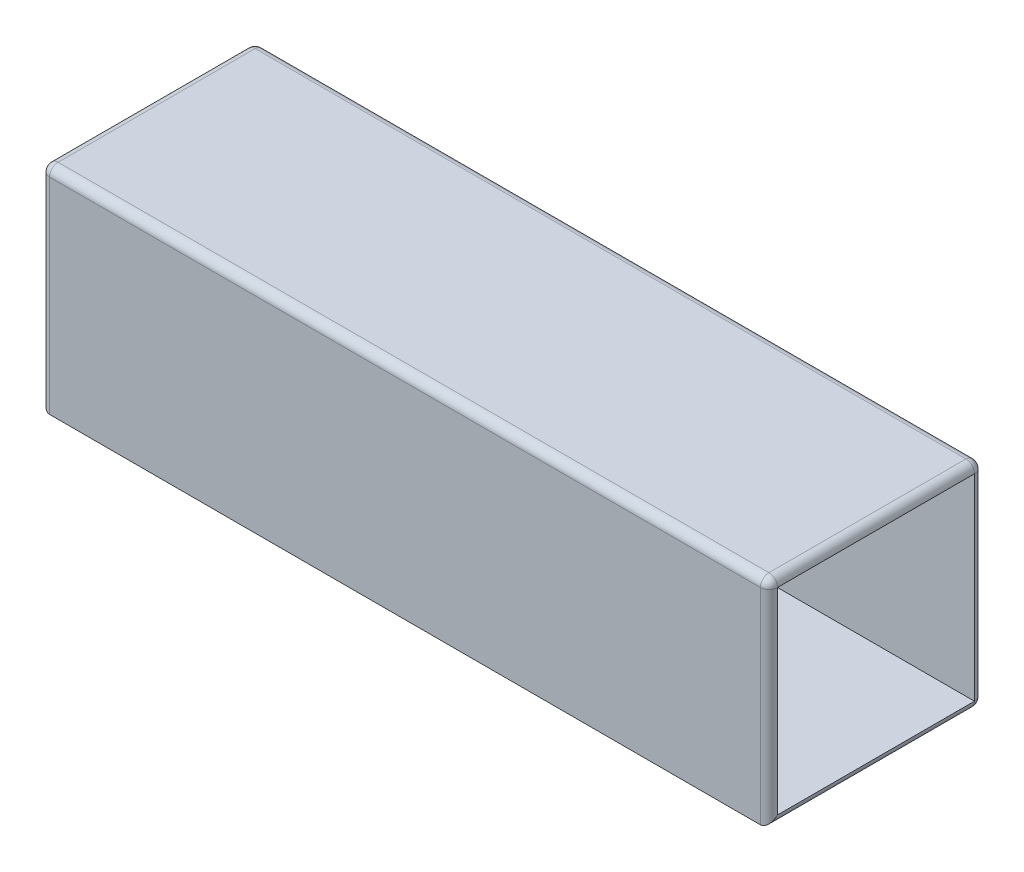
ISO-10303-21;
HEADER;
FILE_DESCRIPTION(('STEP AP214'),'2;1');
FILE_NAME('part.step','',(''),(''),'','','');
FILE_SCHEMA(('AUTOMOTIVE_DESIGN { 1 0 10303 214 1 1 1 1 }'));
ENDSEC;
DATA;
#1=APPLICATION_CONTEXT('core data for automotive mechanical design processes');
#2=APPLICATION_PROTOCOL_DEFINITION('international standard','automotive_design',2000,#1);
#3=PRODUCT_CONTEXT('',#1,'mechanical');
#4=PRODUCT('Part','Part','',(#3));
#5=PRODUCT_RELATED_PRODUCT_CATEGORY('part','',(#4));
#6=PRODUCT_DEFINITION_FORMATION('','',#4);
#7=PRODUCT_DEFINITION_CONTEXT('part definition',#1,'design');
#8=PRODUCT_DEFINITION('design','',#6,#7);
#9=PRODUCT_DEFINITION_SHAPE('','',#8);
#10=(LENGTH_UNIT() NAMED_UNIT(*) SI_UNIT(.MILLI.,.METRE.));
#11=(NAMED_UNIT(*) PLANE_ANGLE_UNIT() SI_UNIT($,.RADIAN.));
#12=(NAMED_UNIT(*) SI_UNIT($,.STERADIAN.) SOLID_ANGLE_UNIT());
#13=UNCERTAINTY_MEASURE_WITH_UNIT(LENGTH_MEASURE(1.E-05),#10,'distance_accuracy_value','');
#14=(GEOMETRIC_REPRESENTATION_CONTEXT(3) GLOBAL_UNCERTAINTY_ASSIGNED_CONTEXT((#13)) GLOBAL_UNIT_ASSIGNED_CONTEXT((#10,
#11,#12)) REPRESENTATION_CONTEXT('',''));
#15=CARTESIAN_POINT('',(0.,0.,0.));
#16=DIRECTION('',(0.,0.,1.));
#17=DIRECTION('',(1.,0.,0.));
#18=AXIS2_PLACEMENT_3D('',#15,#16,#17);
#19=CARTESIAN_POINT('',(-107.95,63.5,31.75));
#20=DIRECTION('',(1.,0.,0.));
#21=DIRECTION('',(0.,0.,-1.));
#22=AXIS2_PLACEMENT_3D('',#19,#20,#21);
#23=PLANE('',#22);
#24=DIRECTION('',(0.,0.,1.));
#25=VECTOR('',#24,1.);
#26=CARTESIAN_POINT('',(-107.95,60.96,-31.75));
#27=LINE('',#26,#25);
#28=CARTESIAN_POINT('',(-107.95,60.96,29.21));
#29=VERTEX_POINT('',#28);
#30=CARTESIAN_POINT('',(-107.95,60.96,-29.21));
#31=VERTEX_POINT('',#30);
#32=EDGE_CURVE('E204',#29,#31,#27,.F.);
#33=ORIENTED_EDGE('',*,*,#32,.T.);
#34=DIRECTION('',(0.,-1.,0.));
#35=VECTOR('',#34,1.);
#36=CARTESIAN_POINT('',(-107.95,63.5,-29.21));
#37=LINE('',#36,#35);
#38=CARTESIAN_POINT('',(-107.95,2.54,-29.21));
#39=VERTEX_POINT('',#38);
#40=EDGE_CURVE('E249',#31,#39,#37,.T.);
#41=ORIENTED_EDGE('',*,*,#40,.T.);
#42=DIRECTION('',(0.,0.,1.));
#43=VECTOR('',#42,1.);
#44=CARTESIAN_POINT('',(-107.95,2.54,31.75));
#45=LINE('',#44,#43);
#46=CARTESIAN_POINT('',(-107.95,2.54,29.21));
#47=VERTEX_POINT('',#46);
#48=EDGE_CURVE('E207',#39,#47,#45,.T.);
#49=ORIENTED_EDGE('',*,*,#48,.T.);
#50=DIRECTION('',(0.,-1.,0.));
#51=VECTOR('',#50,1.);
#52=CARTESIAN_POINT('',(-107.95,63.5,29.21));
#53=LINE('',#52,#51);
#54=EDGE_CURVE('E198',#47,#29,#53,.F.);
#55=ORIENTED_EDGE('',*,*,#54,.T.);
#56=EDGE_LOOP('',(#33,#41,#49,#55));
#57=FACE_BOUND('',#56,.T.);
#58=ADVANCED_FACE('F39',(#57),#23,.F.);
#59=CARTESIAN_POINT('',(107.95,63.5,31.75));
#60=DIRECTION('',(0.,0.,-1.));
#61=DIRECTION('',(-1.,0.,0.));
#62=AXIS2_PLACEMENT_3D('',#59,#60,#61);
#63=PLANE('',#62);
#64=DIRECTION('',(0.,-1.,0.));
#65=VECTOR('',#64,1.);
#66=CARTESIAN_POINT('',(105.41,63.5,31.75));
#67=LINE('',#66,#65);
#68=CARTESIAN_POINT('',(105.41,0.,31.75));
#69=VERTEX_POINT('',#68);
#70=CARTESIAN_POINT('',(105.41,60.96,31.75));
#71=VERTEX_POINT('',#70);
#72=EDGE_CURVE('E196',#69,#71,#67,.F.);
#73=ORIENTED_EDGE('',*,*,#72,.T.);
#74=DIRECTION('',(1.,0.,0.));
#75=VECTOR('',#74,1.);
#76=CARTESIAN_POINT('',(-105.41,60.96,31.75));
#77=LINE('',#76,#75);
#78=CARTESIAN_POINT('',(-105.41,60.96,31.75));
#79=VERTEX_POINT('',#78);
#80=EDGE_CURVE('E11',#71,#79,#77,.F.);
#81=ORIENTED_EDGE('',*,*,#80,.T.);
#82=DIRECTION('',(0.,-1.,0.));
#83=VECTOR('',#82,1.);
#84=CARTESIAN_POINT('',(-105.41,63.5,31.75));
#85=LINE('',#84,#83);
#86=CARTESIAN_POINT('',(-105.41,0.,31.75));
#87=VERTEX_POINT('',#86);
#88=EDGE_CURVE('E223',#79,#87,#85,.T.);
#89=ORIENTED_EDGE('',*,*,#88,.T.);
#90=DIRECTION('',(1.,0.,0.));
#91=VECTOR('',#90,1.);
#92=CARTESIAN_POINT('',(107.95,0.,31.75));
#93=LINE('',#92,#91);
#94=EDGE_CURVE('E167',#87,#69,#93,.T.);
#95=ORIENTED_EDGE('',*,*,#94,.T.);
#96=EDGE_LOOP('',(#73,#81,#89,#95));
#97=FACE_BOUND('',#96,.T.);
#98=ADVANCED_FACE('F369',(#97),#63,.F.);
#99=CARTESIAN_POINT('',(107.95,63.5,-31.75));
#100=DIRECTION('',(0.,0.,1.));
#101=DIRECTION('',(1.,0.,0.));
#102=AXIS2_PLACEMENT_3D('',#99,#100,#101);
#103=PLANE('',#102);
#104=DIRECTION('',(0.,-1.,0.));
#105=VECTOR('',#104,1.);
#106=CARTESIAN_POINT('',(105.41,63.5,-31.75));
#107=LINE('',#106,#105);
#108=CARTESIAN_POINT('',(105.41,60.96,-31.75));
#109=VERTEX_POINT('',#108);
#110=CARTESIAN_POINT('',(105.41,2.54,-31.75));
#111=VERTEX_POINT('',#110);
#112=EDGE_CURVE('E193',#109,#111,#107,.T.);
#113=ORIENTED_EDGE('',*,*,#112,.T.);
#114=DIRECTION('',(-1.,0.,0.));
#115=VECTOR('',#114,1.);
#116=CARTESIAN_POINT('',(107.95,2.54,-31.75));
#117=LINE('',#116,#115);
#118=CARTESIAN_POINT('',(-105.41,2.54,-31.75));
#119=VERTEX_POINT('',#118);
#120=EDGE_CURVE('E243',#111,#119,#117,.T.);
#121=ORIENTED_EDGE('',*,*,#120,.T.);
#122=DIRECTION('',(0.,-1.,0.));
#123=VECTOR('',#122,1.);
#124=CARTESIAN_POINT('',(-105.41,63.5,-31.75));
#125=LINE('',#124,#123);
#126=CARTESIAN_POINT('',(-105.41,60.96,-31.75));
#127=VERTEX_POINT('',#126);
#128=EDGE_CURVE('E241',#119,#127,#125,.F.);
#129=ORIENTED_EDGE('',*,*,#128,.T.);
#130=DIRECTION('',(-1.,0.,0.));
#131=VECTOR('',#130,1.);
#132=CARTESIAN_POINT('',(105.41,60.96,-31.75));
#133=LINE('',#132,#131);
#134=EDGE_CURVE('E239',#127,#109,#133,.F.);
#135=ORIENTED_EDGE('',*,*,#134,.T.);
#136=EDGE_LOOP('',(#113,#121,#129,#135));
#137=FACE_BOUND('',#136,.T.);
#138=ADVANCED_FACE('F318',(#137),#103,.F.);
#139=CARTESIAN_POINT('',(0.,63.5,0.));
#140=DIRECTION('',(0.,1.,0.));
#141=DIRECTION('',(0.,0.,1.));
#142=AXIS2_PLACEMENT_3D('',#139,#140,#141);
#143=PLANE('',#142);
#144=DIRECTION('',(0.,0.,-1.));
#145=VECTOR('',#144,1.);
#146=CARTESIAN_POINT('',(105.41,63.5,-31.75));
#147=LINE('',#146,#145);
#148=CARTESIAN_POINT('',(105.41,63.5,29.21));
#149=VERTEX_POINT('',#148);
#150=CARTESIAN_POINT('',(105.41,63.5,-29.21));
#151=VERTEX_POINT('',#150);
#152=EDGE_CURVE('E190',#149,#151,#147,.T.);
#153=ORIENTED_EDGE('',*,*,#152,.T.);
#154=DIRECTION('',(-1.,0.,0.));
#155=VECTOR('',#154,1.);
#156=CARTESIAN_POINT('',(-105.41,63.5,-29.21));
#157=LINE('',#156,#155);
#158=CARTESIAN_POINT('',(-105.41,63.5,-29.21));
#159=VERTEX_POINT('',#158);
#160=EDGE_CURVE('E48',#151,#159,#157,.T.);
#161=ORIENTED_EDGE('',*,*,#160,.T.);
#162=DIRECTION('',(0.,0.,1.));
#163=VECTOR('',#162,1.);
#164=CARTESIAN_POINT('',(-105.41,63.5,31.75));
#165=LINE('',#164,#163);
#166=CARTESIAN_POINT('',(-105.41,63.5,29.21));
#167=VERTEX_POINT('',#166);
#168=EDGE_CURVE('E220',#159,#167,#165,.T.);
#169=ORIENTED_EDGE('',*,*,#168,.T.);
#170=DIRECTION('',(1.,0.,0.));
#171=VECTOR('',#170,1.);
#172=CARTESIAN_POINT('',(105.41,63.5,29.21));
#173=LINE('',#172,#171);
#174=EDGE_CURVE('E259',#167,#149,#173,.T.);
#175=ORIENTED_EDGE('',*,*,#174,.T.);
#176=EDGE_LOOP('',(#153,#161,#169,#175));
#177=FACE_BOUND('',#176,.T.);
#178=ADVANCED_FACE('F331',(#177),#143,.T.);
#179=CARTESIAN_POINT('',(0.,0.,0.));
#180=DIRECTION('',(0.,1.,0.));
#181=DIRECTION('',(0.,0.,1.));
#182=AXIS2_PLACEMENT_3D('',#179,#180,#181);
#183=PLANE('',#182);
#184=DIRECTION('',(0.,0.,1.));
#185=VECTOR('',#184,1.);
#186=CARTESIAN_POINT('',(-105.41,0.,0.));
#187=LINE('',#186,#185);
#188=CARTESIAN_POINT('',(-105.41,0.,-29.21));
#189=VERTEX_POINT('',#188);
#190=EDGE_CURVE('E209',#87,#189,#187,.F.);
#191=ORIENTED_EDGE('',*,*,#190,.T.);
#192=DIRECTION('',(-1.,0.,0.));
#193=VECTOR('',#192,1.);
#194=CARTESIAN_POINT('',(0.,0.,-29.21));
#195=LINE('',#194,#193);
#196=CARTESIAN_POINT('',(105.41,0.,-29.21));
#197=VERTEX_POINT('',#196);
#198=EDGE_CURVE('E245',#189,#197,#195,.F.);
#199=ORIENTED_EDGE('',*,*,#198,.T.);
#200=DIRECTION('',(0.,0.,-1.));
#201=VECTOR('',#200,1.);
#202=CARTESIAN_POINT('',(105.41,0.,0.));
#203=LINE('',#202,#201);
#204=EDGE_CURVE('E170',#197,#69,#203,.F.);
#205=ORIENTED_EDGE('',*,*,#204,.T.);
#206=ORIENTED_EDGE('',*,*,#94,.F.);
#207=EDGE_LOOP('',(#191,#199,#205,#206));
#208=FACE_BOUND('',#207,.T.);
#209=ADVANCED_FACE('F357',(#208),#183,.F.);
#210=CARTESIAN_POINT('',(-105.41,63.5,31.75));
#211=DIRECTION('',(1.,0.,0.));
#212=DIRECTION('',(0.,0.,-1.));
#213=AXIS2_PLACEMENT_3D('',#210,#211,#212);
#214=PLANE('',#213);
#215=DIRECTION('',(0.,0.,1.));
#216=VECTOR('',#215,1.);
#217=CARTESIAN_POINT('',(-105.41,2.54,31.75));
#218=LINE('',#217,#216);
#219=CARTESIAN_POINT('',(-105.41,2.54,-26.67));
#220=VERTEX_POINT('',#219);
#221=CARTESIAN_POINT('',(-105.41,2.54,29.21));
#222=VERTEX_POINT('',#221);
#223=EDGE_CURVE('E141',#220,#222,#218,.T.);
#224=ORIENTED_EDGE('',*,*,#223,.F.);
#225=DIRECTION('',(0.,-1.,0.));
#226=VECTOR('',#225,1.);
#227=CARTESIAN_POINT('',(-105.41,60.96,-26.67));
#228=LINE('',#227,#226);
#229=CARTESIAN_POINT('',(-105.41,60.96,-26.67));
#230=VERTEX_POINT('',#229);
#231=EDGE_CURVE('E216',#220,#230,#228,.F.);
#232=ORIENTED_EDGE('',*,*,#231,.T.);
#233=DIRECTION('',(0.,0.,1.));
#234=VECTOR('',#233,1.);
#235=CARTESIAN_POINT('',(-105.41,60.96,31.75));
#236=LINE('',#235,#234);
#237=CARTESIAN_POINT('',(-105.41,60.96,29.21));
#238=VERTEX_POINT('',#237);
#239=EDGE_CURVE('E165',#230,#238,#236,.T.);
#240=ORIENTED_EDGE('',*,*,#239,.T.);
#241=DIRECTION('',(0.,-1.,0.));
#242=VECTOR('',#241,1.);
#243=CARTESIAN_POINT('',(-105.41,63.5,29.21));
#244=LINE('',#243,#242);
#245=EDGE_CURVE('E158',#238,#222,#244,.T.);
#246=ORIENTED_EDGE('',*,*,#245,.T.);
#247=EDGE_LOOP('',(#224,#232,#240,#246));
#248=FACE_BOUND('',#247,.T.);
#249=ADVANCED_FACE('F163',(#248),#214,.T.);
#250=CARTESIAN_POINT('',(107.95,63.5,29.21));
#251=DIRECTION('',(0.,0.,-1.));
#252=DIRECTION('',(-1.,0.,0.));
#253=AXIS2_PLACEMENT_3D('',#250,#251,#252);
#254=PLANE('',#253);
#255=DIRECTION('',(1.,0.,0.));
#256=VECTOR('',#255,1.);
#257=CARTESIAN_POINT('',(107.95,2.54,29.21));
#258=LINE('',#257,#256);
#259=CARTESIAN_POINT('',(107.95,2.54,29.21));
#260=VERTEX_POINT('',#259);
#261=EDGE_CURVE('E146',#222,#260,#258,.T.);
#262=ORIENTED_EDGE('',*,*,#261,.F.);
#263=ORIENTED_EDGE('',*,*,#245,.F.);
#264=DIRECTION('',(1.,0.,0.));
#265=VECTOR('',#264,1.);
#266=CARTESIAN_POINT('',(107.95,60.96,29.21));
#267=LINE('',#266,#265);
#268=CARTESIAN_POINT('',(107.95,60.96,29.21));
#269=VERTEX_POINT('',#268);
#270=EDGE_CURVE('E175',#238,#269,#267,.T.);
#271=ORIENTED_EDGE('',*,*,#270,.T.);
#272=DIRECTION('',(0.,-1.,0.));
#273=VECTOR('',#272,1.);
#274=CARTESIAN_POINT('',(107.95,63.5,29.21));
#275=LINE('',#274,#273);
#276=EDGE_CURVE('E159',#269,#260,#275,.T.);
#277=ORIENTED_EDGE('',*,*,#276,.T.);
#278=EDGE_LOOP('',(#262,#263,#271,#277));
#279=FACE_BOUND('',#278,.T.);
#280=ADVANCED_FACE('F156',(#279),#254,.T.);
#281=CARTESIAN_POINT('',(107.95,63.5,-29.21));
#282=DIRECTION('',(0.,0.,1.));
#283=DIRECTION('',(1.,0.,0.));
#284=AXIS2_PLACEMENT_3D('',#281,#282,#283);
#285=PLANE('',#284);
#286=DIRECTION('',(-1.,0.,0.));
#287=VECTOR('',#286,1.);
#288=CARTESIAN_POINT('',(107.95,60.96,-29.21));
#289=LINE('',#288,#287);
#290=CARTESIAN_POINT('',(107.95,60.96,-29.21));
#291=VERTEX_POINT('',#290);
#292=CARTESIAN_POINT('',(-102.87,60.96,-29.21));
#293=VERTEX_POINT('',#292);
#294=EDGE_CURVE('E180',#291,#293,#289,.T.);
#295=ORIENTED_EDGE('',*,*,#294,.T.);
#296=DIRECTION('',(0.,-1.,0.));
#297=VECTOR('',#296,1.);
#298=CARTESIAN_POINT('',(-102.87,2.54,-29.21));
#299=LINE('',#298,#297);
#300=CARTESIAN_POINT('',(-102.87,2.54,-29.21));
#301=VERTEX_POINT('',#300);
#302=EDGE_CURVE('E212',#293,#301,#299,.T.);
#303=ORIENTED_EDGE('',*,*,#302,.T.);
#304=DIRECTION('',(-1.,0.,0.));
#305=VECTOR('',#304,1.);
#306=CARTESIAN_POINT('',(107.95,2.54,-29.21));
#307=LINE('',#306,#305);
#308=CARTESIAN_POINT('',(107.95,2.54,-29.21));
#309=VERTEX_POINT('',#308);
#310=EDGE_CURVE('E176',#309,#301,#307,.T.);
#311=ORIENTED_EDGE('',*,*,#310,.F.);
#312=DIRECTION('',(0.,-1.,0.));
#313=VECTOR('',#312,1.);
#314=CARTESIAN_POINT('',(107.95,63.5,-29.21));
#315=LINE('',#314,#313);
#316=EDGE_CURVE('E172',#291,#309,#315,.T.);
#317=ORIENTED_EDGE('',*,*,#316,.F.);
#318=EDGE_LOOP('',(#295,#303,#311,#317));
#319=FACE_BOUND('',#318,.T.);
#320=ADVANCED_FACE('F307',(#319),#285,.T.);
#321=CARTESIAN_POINT('',(0.,60.96,0.));
#322=DIRECTION('',(0.,1.,0.));
#323=DIRECTION('',(0.,0.,1.));
#324=AXIS2_PLACEMENT_3D('',#321,#322,#323);
#325=PLANE('',#324);
#326=ORIENTED_EDGE('',*,*,#239,.F.);
#327=CARTESIAN_POINT('',(-102.87,60.96,-26.67));
#328=DIRECTION('',(0.,1.,0.));
#329=DIRECTION('',(0.,0.,1.));
#330=AXIS2_PLACEMENT_3D('',#327,#328,#329);
#331=CIRCLE('',#330,2.54);
#332=EDGE_CURVE('E218',#230,#293,#331,.F.);
#333=ORIENTED_EDGE('',*,*,#332,.T.);
#334=ORIENTED_EDGE('',*,*,#294,.F.);
#335=DIRECTION('',(0.,0.,-1.));
#336=VECTOR('',#335,1.);
#337=CARTESIAN_POINT('',(107.95,60.96,31.75));
#338=LINE('',#337,#336);
#339=EDGE_CURVE('E179',#269,#291,#338,.T.);
#340=ORIENTED_EDGE('',*,*,#339,.F.);
#341=ORIENTED_EDGE('',*,*,#270,.F.);
#342=EDGE_LOOP('',(#326,#333,#334,#340,#341));
#343=FACE_BOUND('',#342,.T.);
#344=ADVANCED_FACE('F296',(#343),#325,.F.);
#345=CARTESIAN_POINT('',(0.,2.54,0.));
#346=DIRECTION('',(0.,1.,0.));
#347=DIRECTION('',(0.,0.,1.));
#348=AXIS2_PLACEMENT_3D('',#345,#346,#347);
#349=PLANE('',#348);
#350=ORIENTED_EDGE('',*,*,#310,.T.);
#351=CARTESIAN_POINT('',(-102.87,2.54,-26.67));
#352=DIRECTION('',(0.,1.,0.));
#353=DIRECTION('',(0.,0.,1.));
#354=AXIS2_PLACEMENT_3D('',#351,#352,#353);
#355=CIRCLE('',#354,2.54);
#356=EDGE_CURVE('E148',#301,#220,#355,.T.);
#357=ORIENTED_EDGE('',*,*,#356,.T.);
#358=ORIENTED_EDGE('',*,*,#223,.T.);
#359=ORIENTED_EDGE('',*,*,#261,.T.);
#360=DIRECTION('',(0.,0.,-1.));
#361=VECTOR('',#360,1.);
#362=CARTESIAN_POINT('',(107.95,2.54,31.75));
#363=LINE('',#362,#361);
#364=EDGE_CURVE('E161',#260,#309,#363,.T.);
#365=ORIENTED_EDGE('',*,*,#364,.T.);
#366=EDGE_LOOP('',(#350,#357,#358,#359,#365));
#367=FACE_BOUND('',#366,.T.);
#368=ADVANCED_FACE('F144',(#367),#349,.T.);
#369=CARTESIAN_POINT('',(105.41,60.96,0.));
#370=DIRECTION('',(0.,0.,1.));
#371=DIRECTION('',(1.,0.,0.));
#372=AXIS2_PLACEMENT_3D('',#369,#370,#371);
#373=CYLINDRICAL_SURFACE('',#372,2.54);
#374=ORIENTED_EDGE('',*,*,#339,.T.);
#375=CARTESIAN_POINT('',(105.41,60.96,-29.21));
#376=DIRECTION('',(0.,0.,1.));
#377=DIRECTION('',(1.,0.,0.));
#378=AXIS2_PLACEMENT_3D('',#375,#376,#377);
#379=CIRCLE('',#378,2.54);
#380=EDGE_CURVE('E235',#291,#151,#379,.T.);
#381=ORIENTED_EDGE('',*,*,#380,.T.);
#382=ORIENTED_EDGE('',*,*,#152,.F.);
#383=CARTESIAN_POINT('',(105.41,60.96,29.21));
#384=DIRECTION('',(0.,0.,1.));
#385=DIRECTION('',(1.,0.,0.));
#386=AXIS2_PLACEMENT_3D('',#383,#384,#385);
#387=CIRCLE('',#386,2.54);
#388=EDGE_CURVE('E233',#149,#269,#387,.F.);
#389=ORIENTED_EDGE('',*,*,#388,.T.);
#390=EDGE_LOOP('',(#374,#381,#382,#389));
#391=FACE_BOUND('',#390,.T.);
#392=ADVANCED_FACE('F293',(#391),#373,.T.);
#393=CARTESIAN_POINT('',(105.41,63.5,29.21));
#394=DIRECTION('',(0.,-1.,0.));
#395=DIRECTION('',(0.,0.,-1.));
#396=AXIS2_PLACEMENT_3D('',#393,#394,#395);
#397=CYLINDRICAL_SURFACE('',#396,2.54);
#398=ORIENTED_EDGE('',*,*,#276,.F.);
#399=CARTESIAN_POINT('',(105.41,60.96,29.21));
#400=DIRECTION('',(0.,-1.,0.));
#401=DIRECTION('',(0.,0.,-1.));
#402=AXIS2_PLACEMENT_3D('',#399,#400,#401);
#403=CIRCLE('',#402,2.54);
#404=EDGE_CURVE('E56',#269,#71,#403,.T.);
#405=ORIENTED_EDGE('',*,*,#404,.T.);
#406=ORIENTED_EDGE('',*,*,#72,.F.);
#407=CARTESIAN_POINT('',(105.41,2.54,29.21));
#408=DIRECTION('',(0.,-0.707106781186547,-0.707106781186547));
#409=DIRECTION('',(0.,-0.707106781186547,0.707106781186547));
#410=AXIS2_PLACEMENT_3D('',#407,#408,#409);
#411=ELLIPSE('',#410,3.59210244842766,2.54);
#412=EDGE_CURVE('E152',#260,#69,#411,.T.);
#413=ORIENTED_EDGE('',*,*,#412,.F.);
#414=EDGE_LOOP('',(#398,#405,#406,#413));
#415=FACE_BOUND('',#414,.T.);
#416=ADVANCED_FACE('F297',(#415),#397,.T.);
#417=CARTESIAN_POINT('',(105.41,63.5,-29.21));
#418=DIRECTION('',(0.,-1.,0.));
#419=DIRECTION('',(0.,0.,-1.));
#420=AXIS2_PLACEMENT_3D('',#417,#418,#419);
#421=CYLINDRICAL_SURFACE('',#420,2.54);
#422=ORIENTED_EDGE('',*,*,#112,.F.);
#423=CARTESIAN_POINT('',(105.41,60.96,-29.21));
#424=DIRECTION('',(0.,-1.,0.));
#425=DIRECTION('',(0.,0.,-1.));
#426=AXIS2_PLACEMENT_3D('',#423,#424,#425);
#427=CIRCLE('',#426,2.54);
#428=EDGE_CURVE('E230',#109,#291,#427,.T.);
#429=ORIENTED_EDGE('',*,*,#428,.T.);
#430=ORIENTED_EDGE('',*,*,#316,.T.);
#431=CARTESIAN_POINT('',(105.41,2.54,-29.21));
#432=DIRECTION('',(0.,-1.,0.));
#433=DIRECTION('',(0.,0.,-1.));
#434=AXIS2_PLACEMENT_3D('',#431,#432,#433);
#435=CIRCLE('',#434,2.54);
#436=EDGE_CURVE('E225',#309,#111,#435,.F.);
#437=ORIENTED_EDGE('',*,*,#436,.T.);
#438=EDGE_LOOP('',(#422,#429,#430,#437));
#439=FACE_BOUND('',#438,.T.);
#440=ADVANCED_FACE('F315',(#439),#421,.T.);
#441=CARTESIAN_POINT('',(105.41,2.54,31.75));
#442=DIRECTION('',(0.,0.,-1.));
#443=DIRECTION('',(-1.,0.,0.));
#444=AXIS2_PLACEMENT_3D('',#441,#442,#443);
#445=CYLINDRICAL_SURFACE('',#444,2.54);
#446=ORIENTED_EDGE('',*,*,#204,.F.);
#447=CARTESIAN_POINT('',(105.41,2.54,-29.21));
#448=DIRECTION('',(0.,0.,-1.));
#449=DIRECTION('',(-1.,0.,0.));
#450=AXIS2_PLACEMENT_3D('',#447,#448,#449);
#451=CIRCLE('',#450,2.54);
#452=EDGE_CURVE('E237',#197,#309,#451,.F.);
#453=ORIENTED_EDGE('',*,*,#452,.T.);
#454=ORIENTED_EDGE('',*,*,#364,.F.);
#455=ORIENTED_EDGE('',*,*,#412,.T.);
#456=EDGE_LOOP('',(#446,#453,#454,#455));
#457=FACE_BOUND('',#456,.T.);
#458=ADVANCED_FACE('F301',(#457),#445,.T.);
#459=CARTESIAN_POINT('',(-105.41,60.96,0.));
#460=DIRECTION('',(0.,0.,-1.));
#461=DIRECTION('',(-1.,0.,0.));
#462=AXIS2_PLACEMENT_3D('',#459,#460,#461);
#463=CYLINDRICAL_SURFACE('',#462,2.54);
#464=ORIENTED_EDGE('',*,*,#168,.F.);
#465=CARTESIAN_POINT('',(-105.41,60.96,-29.21));
#466=DIRECTION('',(0.,0.,-1.));
#467=DIRECTION('',(-1.,0.,0.));
#468=AXIS2_PLACEMENT_3D('',#465,#466,#467);
#469=CIRCLE('',#468,2.54);
#470=EDGE_CURVE('E253',#159,#31,#469,.F.);
#471=ORIENTED_EDGE('',*,*,#470,.T.);
#472=ORIENTED_EDGE('',*,*,#32,.F.);
#473=CARTESIAN_POINT('',(-105.41,60.96,29.21));
#474=DIRECTION('',(0.,0.,-1.));
#475=DIRECTION('',(-1.,0.,0.));
#476=AXIS2_PLACEMENT_3D('',#473,#474,#475);
#477=CIRCLE('',#476,2.54);
#478=EDGE_CURVE('E251',#29,#167,#477,.T.);
#479=ORIENTED_EDGE('',*,*,#478,.T.);
#480=EDGE_LOOP('',(#464,#471,#472,#479));
#481=FACE_BOUND('',#480,.T.);
#482=ADVANCED_FACE('F335',(#481),#463,.T.);
#483=CARTESIAN_POINT('',(-105.41,63.5,29.21));
#484=DIRECTION('',(0.,-1.,0.));
#485=DIRECTION('',(0.,0.,-1.));
#486=AXIS2_PLACEMENT_3D('',#483,#484,#485);
#487=CYLINDRICAL_SURFACE('',#486,2.54);
#488=ORIENTED_EDGE('',*,*,#88,.F.);
#489=CARTESIAN_POINT('',(-105.41,60.96,29.21));
#490=DIRECTION('',(0.,-1.,0.));
#491=DIRECTION('',(0.,0.,-1.));
#492=AXIS2_PLACEMENT_3D('',#489,#490,#491);
#493=CIRCLE('',#492,2.54);
#494=EDGE_CURVE('E255',#79,#29,#493,.T.);
#495=ORIENTED_EDGE('',*,*,#494,.T.);
#496=ORIENTED_EDGE('',*,*,#54,.F.);
#497=CARTESIAN_POINT('',(-105.41,2.54,29.21));
#498=DIRECTION('',(0.,-0.707106781186547,-0.707106781186547));
#499=DIRECTION('',(0.,-0.707106781186547,0.707106781186547));
#500=AXIS2_PLACEMENT_3D('',#497,#498,#499);
#501=ELLIPSE('',#500,3.59210244842766,2.54);
#502=EDGE_CURVE('E201',#87,#47,#501,.T.);
#503=ORIENTED_EDGE('',*,*,#502,.F.);
#504=EDGE_LOOP('',(#488,#495,#496,#503));
#505=FACE_BOUND('',#504,.T.);
#506=ADVANCED_FACE('F360',(#505),#487,.T.);
#507=CARTESIAN_POINT('',(-105.41,2.54,31.75));
#508=DIRECTION('',(0.,0.,1.));
#509=DIRECTION('',(1.,0.,0.));
#510=AXIS2_PLACEMENT_3D('',#507,#508,#509);
#511=CYLINDRICAL_SURFACE('',#510,2.54);
#512=ORIENTED_EDGE('',*,*,#48,.F.);
#513=CARTESIAN_POINT('',(-105.41,2.54,-29.21));
#514=DIRECTION('',(0.,0.,1.));
#515=DIRECTION('',(1.,0.,0.));
#516=AXIS2_PLACEMENT_3D('',#513,#514,#515);
#517=CIRCLE('',#516,2.54);
#518=EDGE_CURVE('E247',#39,#189,#517,.T.);
#519=ORIENTED_EDGE('',*,*,#518,.T.);
#520=ORIENTED_EDGE('',*,*,#190,.F.);
#521=ORIENTED_EDGE('',*,*,#502,.T.);
#522=EDGE_LOOP('',(#512,#519,#520,#521));
#523=FACE_BOUND('',#522,.T.);
#524=ADVANCED_FACE('F347',(#523),#511,.T.);
#525=CARTESIAN_POINT('',(-102.87,63.5,-26.67));
#526=DIRECTION('',(0.,1.,0.));
#527=DIRECTION('',(0.,0.,1.));
#528=AXIS2_PLACEMENT_3D('',#525,#526,#527);
#529=CYLINDRICAL_SURFACE('',#528,2.54);
#530=ORIENTED_EDGE('',*,*,#332,.F.);
#531=ORIENTED_EDGE('',*,*,#231,.F.);
#532=ORIENTED_EDGE('',*,*,#356,.F.);
#533=ORIENTED_EDGE('',*,*,#302,.F.);
#534=EDGE_LOOP('',(#530,#531,#532,#533));
#535=FACE_BOUND('',#534,.T.);
#536=ADVANCED_FACE('F387',(#535),#529,.F.);
#537=CARTESIAN_POINT('',(105.41,2.54,-29.21));
#538=DIRECTION('',(0.,0.,1.));
#539=DIRECTION('',(1.,0.,0.));
#540=AXIS2_PLACEMENT_3D('',#537,#538,#539);
#541=SPHERICAL_SURFACE('',#540,2.54);
#542=ORIENTED_EDGE('',*,*,#436,.F.);
#543=ORIENTED_EDGE('',*,*,#452,.F.);
#544=CARTESIAN_POINT('',(105.41,2.54,-29.21));
#545=DIRECTION('',(-1.,0.,0.));
#546=DIRECTION('',(0.,0.,1.));
#547=AXIS2_PLACEMENT_3D('',#544,#545,#546);
#548=CIRCLE('',#547,2.54);
#549=EDGE_CURVE('E228',#111,#197,#548,.T.);
#550=ORIENTED_EDGE('',*,*,#549,.F.);
#551=EDGE_LOOP('',(#542,#543,#550));
#552=FACE_BOUND('',#551,.T.);
#553=ADVANCED_FACE('F311',(#552),#541,.T.);
#554=CARTESIAN_POINT('',(107.95,2.54,-29.21));
#555=DIRECTION('',(-1.,0.,0.));
#556=DIRECTION('',(0.,0.,1.));
#557=AXIS2_PLACEMENT_3D('',#554,#555,#556);
#558=CYLINDRICAL_SURFACE('',#557,2.54);
#559=ORIENTED_EDGE('',*,*,#549,.T.);
#560=ORIENTED_EDGE('',*,*,#198,.F.);
#561=CARTESIAN_POINT('',(-105.41,2.54,-29.21));
#562=DIRECTION('',(-1.,0.,0.));
#563=DIRECTION('',(0.,0.,1.));
#564=AXIS2_PLACEMENT_3D('',#561,#562,#563);
#565=CIRCLE('',#564,2.54);
#566=EDGE_CURVE('E274',#119,#189,#565,.T.);
#567=ORIENTED_EDGE('',*,*,#566,.F.);
#568=ORIENTED_EDGE('',*,*,#120,.F.);
#569=EDGE_LOOP('',(#559,#560,#567,#568));
#570=FACE_BOUND('',#569,.T.);
#571=ADVANCED_FACE('F355',(#570),#558,.T.);
#572=CARTESIAN_POINT('',(-105.41,2.54,-29.21));
#573=DIRECTION('',(0.,0.,1.));
#574=DIRECTION('',(1.,0.,0.));
#575=AXIS2_PLACEMENT_3D('',#572,#573,#574);
#576=SPHERICAL_SURFACE('',#575,2.54);
#577=ORIENTED_EDGE('',*,*,#566,.T.);
#578=ORIENTED_EDGE('',*,*,#518,.F.);
#579=CARTESIAN_POINT('',(-105.41,2.54,-29.21));
#580=DIRECTION('',(0.,1.,0.));
#581=DIRECTION('',(0.,0.,1.));
#582=AXIS2_PLACEMENT_3D('',#579,#580,#581);
#583=CIRCLE('',#582,2.54);
#584=EDGE_CURVE('E271',#119,#39,#583,.T.);
#585=ORIENTED_EDGE('',*,*,#584,.F.);
#586=EDGE_LOOP('',(#577,#578,#585));
#587=FACE_BOUND('',#586,.T.);
#588=ADVANCED_FACE('F352',(#587),#576,.T.);
#589=CARTESIAN_POINT('',(-105.41,63.5,-29.21));
#590=DIRECTION('',(0.,-1.,0.));
#591=DIRECTION('',(0.,0.,-1.));
#592=AXIS2_PLACEMENT_3D('',#589,#590,#591);
#593=CYLINDRICAL_SURFACE('',#592,2.54);
#594=ORIENTED_EDGE('',*,*,#584,.T.);
#595=ORIENTED_EDGE('',*,*,#40,.F.);
#596=CARTESIAN_POINT('',(-105.41,60.96,-29.21));
#597=DIRECTION('',(0.,1.,0.));
#598=DIRECTION('',(0.,0.,1.));
#599=AXIS2_PLACEMENT_3D('',#596,#597,#598);
#600=CIRCLE('',#599,2.54);
#601=EDGE_CURVE('E268',#127,#31,#600,.T.);
#602=ORIENTED_EDGE('',*,*,#601,.F.);
#603=ORIENTED_EDGE('',*,*,#128,.F.);
#604=EDGE_LOOP('',(#594,#595,#602,#603));
#605=FACE_BOUND('',#604,.T.);
#606=ADVANCED_FACE('F341',(#605),#593,.T.);
#607=CARTESIAN_POINT('',(-105.41,60.96,-29.21));
#608=DIRECTION('',(0.,0.,1.));
#609=DIRECTION('',(1.,0.,0.));
#610=AXIS2_PLACEMENT_3D('',#607,#608,#609);
#611=SPHERICAL_SURFACE('',#610,2.54);
#612=ORIENTED_EDGE('',*,*,#601,.T.);
#613=ORIENTED_EDGE('',*,*,#470,.F.);
#614=CARTESIAN_POINT('',(-105.41,60.96,-29.21));
#615=DIRECTION('',(1.,0.,0.));
#616=DIRECTION('',(0.,0.,-1.));
#617=AXIS2_PLACEMENT_3D('',#614,#615,#616);
#618=CIRCLE('',#617,2.54);
#619=EDGE_CURVE('E265',#127,#159,#618,.T.);
#620=ORIENTED_EDGE('',*,*,#619,.F.);
#621=EDGE_LOOP('',(#612,#613,#620));
#622=FACE_BOUND('',#621,.T.);
#623=ADVANCED_FACE('F338',(#622),#611,.T.);
#624=CARTESIAN_POINT('',(0.,60.96,-29.21));
#625=DIRECTION('',(1.,0.,0.));
#626=DIRECTION('',(0.,0.,-1.));
#627=AXIS2_PLACEMENT_3D('',#624,#625,#626);
#628=CYLINDRICAL_SURFACE('',#627,2.54);
#629=ORIENTED_EDGE('',*,*,#619,.T.);
#630=ORIENTED_EDGE('',*,*,#160,.F.);
#631=CARTESIAN_POINT('',(105.41,60.96,-29.21));
#632=DIRECTION('',(1.,0.,0.));
#633=DIRECTION('',(0.,0.,-1.));
#634=AXIS2_PLACEMENT_3D('',#631,#632,#633);
#635=CIRCLE('',#634,2.54);
#636=EDGE_CURVE('E262',#109,#151,#635,.T.);
#637=ORIENTED_EDGE('',*,*,#636,.F.);
#638=ORIENTED_EDGE('',*,*,#134,.F.);
#639=EDGE_LOOP('',(#629,#630,#637,#638));
#640=FACE_BOUND('',#639,.T.);
#641=ADVANCED_FACE('F324',(#640),#628,.T.);
#642=CARTESIAN_POINT('',(105.41,60.96,-29.21));
#643=DIRECTION('',(0.,0.,1.));
#644=DIRECTION('',(1.,0.,0.));
#645=AXIS2_PLACEMENT_3D('',#642,#643,#644);
#646=SPHERICAL_SURFACE('',#645,2.54);
#647=ORIENTED_EDGE('',*,*,#636,.T.);
#648=ORIENTED_EDGE('',*,*,#380,.F.);
#649=ORIENTED_EDGE('',*,*,#428,.F.);
#650=EDGE_LOOP('',(#647,#648,#649));
#651=FACE_BOUND('',#650,.T.);
#652=ADVANCED_FACE('F329',(#651),#646,.T.);
#653=CARTESIAN_POINT('',(105.41,60.96,29.21));
#654=DIRECTION('',(0.,0.,1.));
#655=DIRECTION('',(1.,0.,0.));
#656=AXIS2_PLACEMENT_3D('',#653,#654,#655);
#657=SPHERICAL_SURFACE('',#656,2.54);
#658=ORIENTED_EDGE('',*,*,#404,.F.);
#659=ORIENTED_EDGE('',*,*,#388,.F.);
#660=CARTESIAN_POINT('',(105.41,60.96,29.21));
#661=DIRECTION('',(-1.,0.,0.));
#662=DIRECTION('',(0.,0.,1.));
#663=AXIS2_PLACEMENT_3D('',#660,#661,#662);
#664=CIRCLE('',#663,2.54);
#665=EDGE_CURVE('E43',#71,#149,#664,.T.);
#666=ORIENTED_EDGE('',*,*,#665,.F.);
#667=EDGE_LOOP('',(#658,#659,#666));
#668=FACE_BOUND('',#667,.T.);
#669=ADVANCED_FACE('F41',(#668),#657,.T.);
#670=CARTESIAN_POINT('',(0.,60.96,29.21));
#671=DIRECTION('',(-1.,0.,0.));
#672=DIRECTION('',(0.,0.,1.));
#673=AXIS2_PLACEMENT_3D('',#670,#671,#672);
#674=CYLINDRICAL_SURFACE('',#673,2.54);
#675=ORIENTED_EDGE('',*,*,#665,.T.);
#676=ORIENTED_EDGE('',*,*,#174,.F.);
#677=CARTESIAN_POINT('',(-105.41,60.96,29.21));
#678=DIRECTION('',(-1.,0.,0.));
#679=DIRECTION('',(0.,-1.,0.));
#680=AXIS2_PLACEMENT_3D('',#677,#678,#679);
#681=CIRCLE('',#680,2.54);
#682=EDGE_CURVE('E278',#79,#167,#681,.T.);
#683=ORIENTED_EDGE('',*,*,#682,.F.);
#684=ORIENTED_EDGE('',*,*,#80,.F.);
#685=EDGE_LOOP('',(#675,#676,#683,#684));
#686=FACE_BOUND('',#685,.T.);
#687=ADVANCED_FACE('F287',(#686),#674,.T.);
#688=CARTESIAN_POINT('',(-105.41,60.96,29.21));
#689=DIRECTION('',(0.,0.,1.));
#690=DIRECTION('',(1.,0.,0.));
#691=AXIS2_PLACEMENT_3D('',#688,#689,#690);
#692=SPHERICAL_SURFACE('',#691,2.54);
#693=ORIENTED_EDGE('',*,*,#682,.T.);
#694=ORIENTED_EDGE('',*,*,#478,.F.);
#695=ORIENTED_EDGE('',*,*,#494,.F.);
#696=EDGE_LOOP('',(#693,#694,#695));
#697=FACE_BOUND('',#696,.T.);
#698=ADVANCED_FACE('F361',(#697),#692,.T.);
#699=CLOSED_SHELL('',(#58,#98,#138,#178,#209,#249,#280,#320,#344,#368,#392,#416,#440,#458,#482,
#506,#524,#536,#553,#571,#588,#606,#623,#641,#652,#669,#687,#698));
#700=MANIFOLD_SOLID_BREP('B2',#699);
#701=ADVANCED_BREP_SHAPE_REPRESENTATION('',(#18,#700),#14);
#702=SHAPE_DEFINITION_REPRESENTATION(#9,#701);
ENDSEC;
END-ISO-10303-21;
